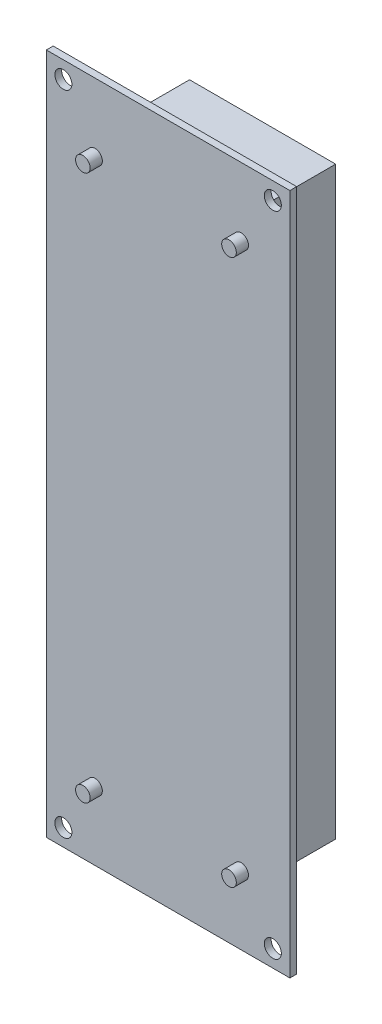
ISO-10303-21;
HEADER;
FILE_DESCRIPTION(('STEP AP214'),'2;1');
FILE_NAME('part.step','',(''),(''),'','','');
FILE_SCHEMA(('AUTOMOTIVE_DESIGN { 1 0 10303 214 1 1 1 1 }'));
ENDSEC;
DATA;
#1=APPLICATION_CONTEXT('core data for automotive mechanical design processes');
#2=APPLICATION_PROTOCOL_DEFINITION('international standard','automotive_design',2000,#1);
#3=PRODUCT_CONTEXT('',#1,'mechanical');
#4=PRODUCT('Part','Part','',(#3));
#5=PRODUCT_RELATED_PRODUCT_CATEGORY('part','',(#4));
#6=PRODUCT_DEFINITION_FORMATION('','',#4);
#7=PRODUCT_DEFINITION_CONTEXT('part definition',#1,'design');
#8=PRODUCT_DEFINITION('design','',#6,#7);
#9=PRODUCT_DEFINITION_SHAPE('','',#8);
#10=(LENGTH_UNIT() NAMED_UNIT(*) SI_UNIT(.MILLI.,.METRE.));
#11=(NAMED_UNIT(*) PLANE_ANGLE_UNIT() SI_UNIT($,.RADIAN.));
#12=(NAMED_UNIT(*) SI_UNIT($,.STERADIAN.) SOLID_ANGLE_UNIT());
#13=UNCERTAINTY_MEASURE_WITH_UNIT(LENGTH_MEASURE(1.E-05),#10,'distance_accuracy_value','');
#14=(GEOMETRIC_REPRESENTATION_CONTEXT(3) GLOBAL_UNCERTAINTY_ASSIGNED_CONTEXT((#13)) GLOBAL_UNIT_ASSIGNED_CONTEXT((#10,
#11,#12)) REPRESENTATION_CONTEXT('',''));
#15=CARTESIAN_POINT('',(0.,0.,0.));
#16=DIRECTION('',(0.,0.,1.));
#17=DIRECTION('',(1.,0.,0.));
#18=AXIS2_PLACEMENT_3D('',#15,#16,#17);
#19=CARTESIAN_POINT('',(25.,-70.,0.7));
#20=DIRECTION('',(-1.,0.,0.));
#21=DIRECTION('',(0.,0.,1.));
#22=AXIS2_PLACEMENT_3D('',#19,#20,#21);
#23=PLANE('',#22);
#24=DIRECTION('',(0.,1.,0.));
#25=VECTOR('',#24,1.);
#26=CARTESIAN_POINT('',(25.,-70.,-0.7));
#27=LINE('',#26,#25);
#28=CARTESIAN_POINT('',(25.,-70.,-0.7));
#29=VERTEX_POINT('',#28);
#30=CARTESIAN_POINT('',(25.,70.,-0.7));
#31=VERTEX_POINT('',#30);
#32=EDGE_CURVE('E116',#29,#31,#27,.T.);
#33=ORIENTED_EDGE('',*,*,#32,.T.);
#34=DIRECTION('',(0.,0.,-1.));
#35=VECTOR('',#34,1.);
#36=CARTESIAN_POINT('',(25.,70.,0.7));
#37=LINE('',#36,#35);
#38=CARTESIAN_POINT('',(25.,70.,0.7));
#39=VERTEX_POINT('',#38);
#40=EDGE_CURVE('E148',#39,#31,#37,.T.);
#41=ORIENTED_EDGE('',*,*,#40,.F.);
#42=DIRECTION('',(0.,1.,0.));
#43=VECTOR('',#42,1.);
#44=CARTESIAN_POINT('',(25.,-70.,0.7));
#45=LINE('',#44,#43);
#46=CARTESIAN_POINT('',(25.,-70.,0.7));
#47=VERTEX_POINT('',#46);
#48=EDGE_CURVE('E125',#47,#39,#45,.T.);
#49=ORIENTED_EDGE('',*,*,#48,.F.);
#50=DIRECTION('',(0.,0.,-1.));
#51=VECTOR('',#50,1.);
#52=CARTESIAN_POINT('',(25.,-70.,0.7));
#53=LINE('',#52,#51);
#54=EDGE_CURVE('E134',#47,#29,#53,.T.);
#55=ORIENTED_EDGE('',*,*,#54,.T.);
#56=EDGE_LOOP('',(#33,#41,#49,#55));
#57=FACE_BOUND('',#56,.T.);
#58=ADVANCED_FACE('F32',(#57),#23,.F.);
#59=CARTESIAN_POINT('',(-25.,70.,0.7));
#60=DIRECTION('',(0.,-1.,0.));
#61=DIRECTION('',(0.,0.,-1.));
#62=AXIS2_PLACEMENT_3D('',#59,#60,#61);
#63=PLANE('',#62);
#64=DIRECTION('',(-1.,0.,0.));
#65=VECTOR('',#64,1.);
#66=CARTESIAN_POINT('',(-25.,70.,-0.7));
#67=LINE('',#66,#65);
#68=CARTESIAN_POINT('',(-25.,70.,-0.7));
#69=VERTEX_POINT('',#68);
#70=EDGE_CURVE('E119',#31,#69,#67,.T.);
#71=ORIENTED_EDGE('',*,*,#70,.T.);
#72=DIRECTION('',(0.,0.,-1.));
#73=VECTOR('',#72,1.);
#74=CARTESIAN_POINT('',(-25.,70.,0.7));
#75=LINE('',#74,#73);
#76=CARTESIAN_POINT('',(-25.,70.,0.7));
#77=VERTEX_POINT('',#76);
#78=EDGE_CURVE('E145',#77,#69,#75,.T.);
#79=ORIENTED_EDGE('',*,*,#78,.F.);
#80=DIRECTION('',(-1.,0.,0.));
#81=VECTOR('',#80,1.);
#82=CARTESIAN_POINT('',(-25.,70.,0.7));
#83=LINE('',#82,#81);
#84=EDGE_CURVE('E128',#39,#77,#83,.T.);
#85=ORIENTED_EDGE('',*,*,#84,.F.);
#86=ORIENTED_EDGE('',*,*,#40,.T.);
#87=EDGE_LOOP('',(#71,#79,#85,#86));
#88=FACE_BOUND('',#87,.T.);
#89=ADVANCED_FACE('F196',(#88),#63,.F.);
#90=CARTESIAN_POINT('',(-25.,-70.,0.7));
#91=DIRECTION('',(1.,0.,0.));
#92=DIRECTION('',(0.,0.,-1.));
#93=AXIS2_PLACEMENT_3D('',#90,#91,#92);
#94=PLANE('',#93);
#95=DIRECTION('',(0.,-1.,0.));
#96=VECTOR('',#95,1.);
#97=CARTESIAN_POINT('',(-25.,-70.,-0.7));
#98=LINE('',#97,#96);
#99=CARTESIAN_POINT('',(-25.,-70.,-0.7));
#100=VERTEX_POINT('',#99);
#101=EDGE_CURVE('E137',#69,#100,#98,.T.);
#102=ORIENTED_EDGE('',*,*,#101,.T.);
#103=DIRECTION('',(0.,0.,-1.));
#104=VECTOR('',#103,1.);
#105=CARTESIAN_POINT('',(-25.,-70.,0.7));
#106=LINE('',#105,#104);
#107=CARTESIAN_POINT('',(-25.,-70.,0.7));
#108=VERTEX_POINT('',#107);
#109=EDGE_CURVE('E142',#108,#100,#106,.T.);
#110=ORIENTED_EDGE('',*,*,#109,.F.);
#111=DIRECTION('',(0.,-1.,0.));
#112=VECTOR('',#111,1.);
#113=CARTESIAN_POINT('',(-25.,-70.,0.7));
#114=LINE('',#113,#112);
#115=EDGE_CURVE('E131',#77,#108,#114,.T.);
#116=ORIENTED_EDGE('',*,*,#115,.F.);
#117=ORIENTED_EDGE('',*,*,#78,.T.);
#118=EDGE_LOOP('',(#102,#110,#116,#117));
#119=FACE_BOUND('',#118,.T.);
#120=ADVANCED_FACE('F201',(#119),#94,.F.);
#121=CARTESIAN_POINT('',(-25.,-70.,0.7));
#122=DIRECTION('',(0.,1.,0.));
#123=DIRECTION('',(0.,0.,1.));
#124=AXIS2_PLACEMENT_3D('',#121,#122,#123);
#125=PLANE('',#124);
#126=DIRECTION('',(1.,0.,0.));
#127=VECTOR('',#126,1.);
#128=CARTESIAN_POINT('',(-25.,-70.,-0.7));
#129=LINE('',#128,#127);
#130=EDGE_CURVE('E129',#100,#29,#129,.T.);
#131=ORIENTED_EDGE('',*,*,#130,.T.);
#132=ORIENTED_EDGE('',*,*,#54,.F.);
#133=DIRECTION('',(1.,0.,0.));
#134=VECTOR('',#133,1.);
#135=CARTESIAN_POINT('',(-25.,-70.,0.7));
#136=LINE('',#135,#134);
#137=EDGE_CURVE('E133',#108,#47,#136,.T.);
#138=ORIENTED_EDGE('',*,*,#137,.F.);
#139=ORIENTED_EDGE('',*,*,#109,.T.);
#140=EDGE_LOOP('',(#131,#132,#138,#139));
#141=FACE_BOUND('',#140,.T.);
#142=ADVANCED_FACE('F165',(#141),#125,.F.);
#143=CARTESIAN_POINT('',(0.,0.,0.7));
#144=DIRECTION('',(0.,0.,-1.));
#145=DIRECTION('',(-1.,0.,0.));
#146=AXIS2_PLACEMENT_3D('',#143,#144,#145);
#147=PLANE('',#146);
#148=CARTESIAN_POINT('',(15.,-56.,0.7));
#149=DIRECTION('',(0.,0.,-1.));
#150=DIRECTION('',(-1.,0.,0.));
#151=AXIS2_PLACEMENT_3D('',#148,#149,#150);
#152=CIRCLE('',#151,1.5);
#153=CARTESIAN_POINT('',(13.5,-56.,0.7));
#154=VERTEX_POINT('',#153);
#155=EDGE_CURVE('E11',#154,#154,#152,.F.);
#156=ORIENTED_EDGE('',*,*,#155,.F.);
#157=EDGE_LOOP('',(#156));
#158=FACE_BOUND('',#157,.T.);
#159=CARTESIAN_POINT('',(-15.,-56.,0.7));
#160=DIRECTION('',(0.,0.,-1.));
#161=DIRECTION('',(-1.,0.,0.));
#162=AXIS2_PLACEMENT_3D('',#159,#160,#161);
#163=CIRCLE('',#162,1.5);
#164=CARTESIAN_POINT('',(-16.5,-56.,0.7));
#165=VERTEX_POINT('',#164);
#166=EDGE_CURVE('E39',#165,#165,#163,.F.);
#167=ORIENTED_EDGE('',*,*,#166,.F.);
#168=EDGE_LOOP('',(#167));
#169=FACE_BOUND('',#168,.T.);
#170=CARTESIAN_POINT('',(-15.,56.,0.7));
#171=DIRECTION('',(0.,0.,-1.));
#172=DIRECTION('',(-1.,0.,0.));
#173=AXIS2_PLACEMENT_3D('',#170,#171,#172);
#174=CIRCLE('',#173,1.5);
#175=CARTESIAN_POINT('',(-16.5,56.,0.7));
#176=VERTEX_POINT('',#175);
#177=EDGE_CURVE('E154',#176,#176,#174,.F.);
#178=ORIENTED_EDGE('',*,*,#177,.F.);
#179=EDGE_LOOP('',(#178));
#180=FACE_BOUND('',#179,.T.);
#181=CARTESIAN_POINT('',(15.,56.,0.7));
#182=DIRECTION('',(0.,0.,-1.));
#183=DIRECTION('',(-1.,0.,0.));
#184=AXIS2_PLACEMENT_3D('',#181,#182,#183);
#185=CIRCLE('',#184,1.5);
#186=CARTESIAN_POINT('',(13.5,56.,0.7));
#187=VERTEX_POINT('',#186);
#188=EDGE_CURVE('E151',#187,#187,#185,.F.);
#189=ORIENTED_EDGE('',*,*,#188,.F.);
#190=EDGE_LOOP('',(#189));
#191=FACE_BOUND('',#190,.T.);
#192=CARTESIAN_POINT('',(-21.5,66.5,0.7));
#193=DIRECTION('',(0.,0.,-1.));
#194=DIRECTION('',(-1.,0.,0.));
#195=AXIS2_PLACEMENT_3D('',#192,#193,#194);
#196=CIRCLE('',#195,1.75);
#197=CARTESIAN_POINT('',(-23.25,66.5,0.7));
#198=VERTEX_POINT('',#197);
#199=EDGE_CURVE('E175',#198,#198,#196,.F.);
#200=ORIENTED_EDGE('',*,*,#199,.F.);
#201=EDGE_LOOP('',(#200));
#202=FACE_BOUND('',#201,.T.);
#203=CARTESIAN_POINT('',(21.5,-66.5,0.7));
#204=DIRECTION('',(0.,0.,-1.));
#205=DIRECTION('',(-1.,0.,0.));
#206=AXIS2_PLACEMENT_3D('',#203,#204,#205);
#207=CIRCLE('',#206,1.75);
#208=CARTESIAN_POINT('',(19.75,-66.5,0.7));
#209=VERTEX_POINT('',#208);
#210=EDGE_CURVE('E179',#209,#209,#207,.F.);
#211=ORIENTED_EDGE('',*,*,#210,.F.);
#212=EDGE_LOOP('',(#211));
#213=FACE_BOUND('',#212,.T.);
#214=CARTESIAN_POINT('',(-21.5,-66.5,0.7));
#215=DIRECTION('',(0.,0.,-1.));
#216=DIRECTION('',(-1.,0.,0.));
#217=AXIS2_PLACEMENT_3D('',#214,#215,#216);
#218=CIRCLE('',#217,1.75);
#219=CARTESIAN_POINT('',(-23.25,-66.5,0.7));
#220=VERTEX_POINT('',#219);
#221=EDGE_CURVE('E183',#220,#220,#218,.F.);
#222=ORIENTED_EDGE('',*,*,#221,.F.);
#223=EDGE_LOOP('',(#222));
#224=FACE_BOUND('',#223,.T.);
#225=CARTESIAN_POINT('',(21.5,66.5,0.7));
#226=DIRECTION('',(0.,0.,-1.));
#227=DIRECTION('',(-1.,0.,0.));
#228=AXIS2_PLACEMENT_3D('',#225,#226,#227);
#229=CIRCLE('',#228,1.75);
#230=CARTESIAN_POINT('',(19.75,66.5,0.7));
#231=VERTEX_POINT('',#230);
#232=EDGE_CURVE('E187',#231,#231,#229,.F.);
#233=ORIENTED_EDGE('',*,*,#232,.F.);
#234=EDGE_LOOP('',(#233));
#235=FACE_BOUND('',#234,.T.);
#236=ORIENTED_EDGE('',*,*,#48,.T.);
#237=ORIENTED_EDGE('',*,*,#84,.T.);
#238=ORIENTED_EDGE('',*,*,#115,.T.);
#239=ORIENTED_EDGE('',*,*,#137,.T.);
#240=EDGE_LOOP('',(#236,#237,#238,#239));
#241=FACE_BOUND('',#240,.T.);
#242=ADVANCED_FACE('F161',(#158,#169,#180,#191,#202,#213,#224,#235,#241),#147,.F.);
#243=CARTESIAN_POINT('',(0.,0.,-0.7));
#244=DIRECTION('',(0.,0.,-1.));
#245=DIRECTION('',(-1.,0.,0.));
#246=AXIS2_PLACEMENT_3D('',#243,#244,#245);
#247=PLANE('',#246);
#248=CARTESIAN_POINT('',(-21.5,66.5,-0.7));
#249=DIRECTION('',(0.,0.,-1.));
#250=DIRECTION('',(-1.,0.,0.));
#251=AXIS2_PLACEMENT_3D('',#248,#249,#250);
#252=CIRCLE('',#251,1.75);
#253=CARTESIAN_POINT('',(-23.25,66.5,-0.7));
#254=VERTEX_POINT('',#253);
#255=EDGE_CURVE('E420',#254,#254,#252,.T.);
#256=ORIENTED_EDGE('',*,*,#255,.F.);
#257=EDGE_LOOP('',(#256));
#258=FACE_BOUND('',#257,.T.);
#259=CARTESIAN_POINT('',(21.5,-66.5,-0.7));
#260=DIRECTION('',(0.,0.,-1.));
#261=DIRECTION('',(-1.,0.,0.));
#262=AXIS2_PLACEMENT_3D('',#259,#260,#261);
#263=CIRCLE('',#262,1.75);
#264=CARTESIAN_POINT('',(19.75,-66.5,-0.7));
#265=VERTEX_POINT('',#264);
#266=EDGE_CURVE('E421',#265,#265,#263,.T.);
#267=ORIENTED_EDGE('',*,*,#266,.F.);
#268=EDGE_LOOP('',(#267));
#269=FACE_BOUND('',#268,.T.);
#270=CARTESIAN_POINT('',(-21.5,-66.5,-0.7));
#271=DIRECTION('',(0.,0.,-1.));
#272=DIRECTION('',(-1.,0.,0.));
#273=AXIS2_PLACEMENT_3D('',#270,#271,#272);
#274=CIRCLE('',#273,1.75);
#275=CARTESIAN_POINT('',(-23.25,-66.5,-0.7));
#276=VERTEX_POINT('',#275);
#277=EDGE_CURVE('E428',#276,#276,#274,.T.);
#278=ORIENTED_EDGE('',*,*,#277,.F.);
#279=EDGE_LOOP('',(#278));
#280=FACE_BOUND('',#279,.T.);
#281=CARTESIAN_POINT('',(21.5,66.5,-0.7));
#282=DIRECTION('',(0.,0.,-1.));
#283=DIRECTION('',(-1.,0.,0.));
#284=AXIS2_PLACEMENT_3D('',#281,#282,#283);
#285=CIRCLE('',#284,1.75);
#286=CARTESIAN_POINT('',(19.75,66.5,-0.7));
#287=VERTEX_POINT('',#286);
#288=EDGE_CURVE('E416',#287,#287,#285,.T.);
#289=ORIENTED_EDGE('',*,*,#288,.F.);
#290=EDGE_LOOP('',(#289));
#291=FACE_BOUND('',#290,.T.);
#292=DIRECTION('',(1.,0.,0.));
#293=VECTOR('',#292,1.);
#294=CARTESIAN_POINT('',(-15.,60.,-0.7));
#295=LINE('',#294,#293);
#296=CARTESIAN_POINT('',(-15.,60.,-0.7));
#297=VERTEX_POINT('',#296);
#298=CARTESIAN_POINT('',(15.,60.,-0.7));
#299=VERTEX_POINT('',#298);
#300=EDGE_CURVE('E46',#297,#299,#295,.T.);
#301=ORIENTED_EDGE('',*,*,#300,.F.);
#302=DIRECTION('',(0.,1.,0.));
#303=VECTOR('',#302,1.);
#304=CARTESIAN_POINT('',(-15.,-60.,-0.7));
#305=LINE('',#304,#303);
#306=CARTESIAN_POINT('',(-15.,-60.,-0.7));
#307=VERTEX_POINT('',#306);
#308=EDGE_CURVE('E50',#307,#297,#305,.T.);
#309=ORIENTED_EDGE('',*,*,#308,.F.);
#310=DIRECTION('',(-1.,0.,0.));
#311=VECTOR('',#310,1.);
#312=CARTESIAN_POINT('',(15.,-60.,-0.7));
#313=LINE('',#312,#311);
#314=CARTESIAN_POINT('',(15.,-60.,-0.7));
#315=VERTEX_POINT('',#314);
#316=EDGE_CURVE('E403',#315,#307,#313,.T.);
#317=ORIENTED_EDGE('',*,*,#316,.F.);
#318=DIRECTION('',(0.,-1.,0.));
#319=VECTOR('',#318,1.);
#320=CARTESIAN_POINT('',(15.,60.,-0.7));
#321=LINE('',#320,#319);
#322=EDGE_CURVE('E405',#299,#315,#321,.T.);
#323=ORIENTED_EDGE('',*,*,#322,.F.);
#324=EDGE_LOOP('',(#301,#309,#317,#323));
#325=FACE_BOUND('',#324,.T.);
#326=ORIENTED_EDGE('',*,*,#32,.F.);
#327=ORIENTED_EDGE('',*,*,#130,.F.);
#328=ORIENTED_EDGE('',*,*,#101,.F.);
#329=ORIENTED_EDGE('',*,*,#70,.F.);
#330=EDGE_LOOP('',(#326,#327,#328,#329));
#331=FACE_BOUND('',#330,.T.);
#332=ADVANCED_FACE('F164',(#258,#269,#280,#291,#325,#331),#247,.T.);
#333=CARTESIAN_POINT('',(-15.,60.,-18.7));
#334=DIRECTION('',(0.,-1.,0.));
#335=DIRECTION('',(0.,0.,-1.));
#336=AXIS2_PLACEMENT_3D('',#333,#334,#335);
#337=PLANE('',#336);
#338=ORIENTED_EDGE('',*,*,#300,.T.);
#339=DIRECTION('',(0.,0.,1.));
#340=VECTOR('',#339,1.);
#341=CARTESIAN_POINT('',(15.,60.,-18.7));
#342=LINE('',#341,#340);
#343=CARTESIAN_POINT('',(15.,60.,-18.7));
#344=VERTEX_POINT('',#343);
#345=EDGE_CURVE('E99',#344,#299,#342,.T.);
#346=ORIENTED_EDGE('',*,*,#345,.F.);
#347=DIRECTION('',(1.,0.,0.));
#348=VECTOR('',#347,1.);
#349=CARTESIAN_POINT('',(-15.,60.,-18.7));
#350=LINE('',#349,#348);
#351=CARTESIAN_POINT('',(-15.,60.,-18.7));
#352=VERTEX_POINT('',#351);
#353=EDGE_CURVE('E105',#352,#344,#350,.T.);
#354=ORIENTED_EDGE('',*,*,#353,.F.);
#355=DIRECTION('',(0.,0.,1.));
#356=VECTOR('',#355,1.);
#357=CARTESIAN_POINT('',(-15.,60.,-18.7));
#358=LINE('',#357,#356);
#359=EDGE_CURVE('E407',#352,#297,#358,.T.);
#360=ORIENTED_EDGE('',*,*,#359,.T.);
#361=EDGE_LOOP('',(#338,#346,#354,#360));
#362=FACE_BOUND('',#361,.T.);
#363=ADVANCED_FACE('F115',(#362),#337,.F.);
#364=CARTESIAN_POINT('',(15.,60.,-18.7));
#365=DIRECTION('',(-1.,0.,0.));
#366=DIRECTION('',(0.,0.,1.));
#367=AXIS2_PLACEMENT_3D('',#364,#365,#366);
#368=PLANE('',#367);
#369=ORIENTED_EDGE('',*,*,#322,.T.);
#370=DIRECTION('',(0.,0.,1.));
#371=VECTOR('',#370,1.);
#372=CARTESIAN_POINT('',(15.,-60.,-18.7));
#373=LINE('',#372,#371);
#374=CARTESIAN_POINT('',(15.,-60.,-18.7));
#375=VERTEX_POINT('',#374);
#376=EDGE_CURVE('E101',#375,#315,#373,.T.);
#377=ORIENTED_EDGE('',*,*,#376,.F.);
#378=DIRECTION('',(0.,-1.,0.));
#379=VECTOR('',#378,1.);
#380=CARTESIAN_POINT('',(15.,60.,-18.7));
#381=LINE('',#380,#379);
#382=EDGE_CURVE('E94',#344,#375,#381,.T.);
#383=ORIENTED_EDGE('',*,*,#382,.F.);
#384=ORIENTED_EDGE('',*,*,#345,.T.);
#385=EDGE_LOOP('',(#369,#377,#383,#384));
#386=FACE_BOUND('',#385,.T.);
#387=ADVANCED_FACE('F97',(#386),#368,.F.);
#388=CARTESIAN_POINT('',(15.,-60.,-18.7));
#389=DIRECTION('',(0.,1.,0.));
#390=DIRECTION('',(0.,0.,1.));
#391=AXIS2_PLACEMENT_3D('',#388,#389,#390);
#392=PLANE('',#391);
#393=ORIENTED_EDGE('',*,*,#316,.T.);
#394=DIRECTION('',(0.,0.,1.));
#395=VECTOR('',#394,1.);
#396=CARTESIAN_POINT('',(-15.,-60.,-18.7));
#397=LINE('',#396,#395);
#398=CARTESIAN_POINT('',(-15.,-60.,-18.7));
#399=VERTEX_POINT('',#398);
#400=EDGE_CURVE('E121',#399,#307,#397,.T.);
#401=ORIENTED_EDGE('',*,*,#400,.F.);
#402=DIRECTION('',(-1.,0.,0.));
#403=VECTOR('',#402,1.);
#404=CARTESIAN_POINT('',(15.,-60.,-18.7));
#405=LINE('',#404,#403);
#406=EDGE_CURVE('E104',#375,#399,#405,.T.);
#407=ORIENTED_EDGE('',*,*,#406,.F.);
#408=ORIENTED_EDGE('',*,*,#376,.T.);
#409=EDGE_LOOP('',(#393,#401,#407,#408));
#410=FACE_BOUND('',#409,.T.);
#411=ADVANCED_FACE('F344',(#410),#392,.F.);
#412=CARTESIAN_POINT('',(-15.,-60.,-18.7));
#413=DIRECTION('',(1.,0.,0.));
#414=DIRECTION('',(0.,0.,-1.));
#415=AXIS2_PLACEMENT_3D('',#412,#413,#414);
#416=PLANE('',#415);
#417=ORIENTED_EDGE('',*,*,#308,.T.);
#418=ORIENTED_EDGE('',*,*,#359,.F.);
#419=DIRECTION('',(0.,1.,0.));
#420=VECTOR('',#419,1.);
#421=CARTESIAN_POINT('',(-15.,-60.,-18.7));
#422=LINE('',#421,#420);
#423=EDGE_CURVE('E110',#399,#352,#422,.T.);
#424=ORIENTED_EDGE('',*,*,#423,.F.);
#425=ORIENTED_EDGE('',*,*,#400,.T.);
#426=EDGE_LOOP('',(#417,#418,#424,#425));
#427=FACE_BOUND('',#426,.T.);
#428=ADVANCED_FACE('F341',(#427),#416,.F.);
#429=CARTESIAN_POINT('',(0.,0.,-18.7));
#430=DIRECTION('',(0.,0.,-1.));
#431=DIRECTION('',(-1.,0.,0.));
#432=AXIS2_PLACEMENT_3D('',#429,#430,#431);
#433=PLANE('',#432);
#434=ORIENTED_EDGE('',*,*,#353,.T.);
#435=ORIENTED_EDGE('',*,*,#382,.T.);
#436=ORIENTED_EDGE('',*,*,#406,.T.);
#437=ORIENTED_EDGE('',*,*,#423,.T.);
#438=EDGE_LOOP('',(#434,#435,#436,#437));
#439=FACE_BOUND('',#438,.T.);
#440=ADVANCED_FACE('F108',(#439),#433,.T.);
#441=CARTESIAN_POINT('',(21.5,66.5,5.64974746830584));
#442=DIRECTION('',(0.,0.,-1.));
#443=DIRECTION('',(-1.,0.,0.));
#444=AXIS2_PLACEMENT_3D('',#441,#442,#443);
#445=CYLINDRICAL_SURFACE('',#444,1.75);
#446=ORIENTED_EDGE('',*,*,#232,.T.);
#447=EDGE_LOOP('',(#446));
#448=FACE_BOUND('',#447,.T.);
#449=ORIENTED_EDGE('',*,*,#288,.T.);
#450=EDGE_LOOP('',(#449));
#451=FACE_BOUND('',#450,.T.);
#452=ADVANCED_FACE('F329',(#448,#451),#445,.F.);
#453=CARTESIAN_POINT('',(-21.5,-66.5,5.64974746830584));
#454=DIRECTION('',(0.,0.,-1.));
#455=DIRECTION('',(-1.,0.,0.));
#456=AXIS2_PLACEMENT_3D('',#453,#454,#455);
#457=CYLINDRICAL_SURFACE('',#456,1.75);
#458=ORIENTED_EDGE('',*,*,#221,.T.);
#459=EDGE_LOOP('',(#458));
#460=FACE_BOUND('',#459,.T.);
#461=ORIENTED_EDGE('',*,*,#277,.T.);
#462=EDGE_LOOP('',(#461));
#463=FACE_BOUND('',#462,.T.);
#464=ADVANCED_FACE('F325',(#460,#463),#457,.F.);
#465=CARTESIAN_POINT('',(21.5,-66.5,5.64974746830584));
#466=DIRECTION('',(0.,0.,-1.));
#467=DIRECTION('',(-1.,0.,0.));
#468=AXIS2_PLACEMENT_3D('',#465,#466,#467);
#469=CYLINDRICAL_SURFACE('',#468,1.75);
#470=ORIENTED_EDGE('',*,*,#210,.T.);
#471=EDGE_LOOP('',(#470));
#472=FACE_BOUND('',#471,.T.);
#473=ORIENTED_EDGE('',*,*,#266,.T.);
#474=EDGE_LOOP('',(#473));
#475=FACE_BOUND('',#474,.T.);
#476=ADVANCED_FACE('F328',(#472,#475),#469,.F.);
#477=CARTESIAN_POINT('',(-21.5,66.5,5.64974746830584));
#478=DIRECTION('',(0.,0.,-1.));
#479=DIRECTION('',(-1.,0.,0.));
#480=AXIS2_PLACEMENT_3D('',#477,#478,#479);
#481=CYLINDRICAL_SURFACE('',#480,1.75);
#482=ORIENTED_EDGE('',*,*,#199,.T.);
#483=EDGE_LOOP('',(#482));
#484=FACE_BOUND('',#483,.T.);
#485=ORIENTED_EDGE('',*,*,#255,.T.);
#486=EDGE_LOOP('',(#485));
#487=FACE_BOUND('',#486,.T.);
#488=ADVANCED_FACE('F240',(#484,#487),#481,.F.);
#489=CARTESIAN_POINT('',(15.,56.,3.2));
#490=DIRECTION('',(0.,0.,-1.));
#491=DIRECTION('',(-1.,0.,0.));
#492=AXIS2_PLACEMENT_3D('',#489,#490,#491);
#493=CYLINDRICAL_SURFACE('',#492,1.5);
#494=CARTESIAN_POINT('',(15.,56.,3.2));
#495=DIRECTION('',(0.,0.,1.));
#496=DIRECTION('',(1.,0.,0.));
#497=AXIS2_PLACEMENT_3D('',#494,#495,#496);
#498=CIRCLE('',#497,1.5);
#499=CARTESIAN_POINT('',(16.5,56.,3.2));
#500=VERTEX_POINT('',#499);
#501=EDGE_CURVE('E431',#500,#500,#498,.T.);
#502=ORIENTED_EDGE('',*,*,#501,.F.);
#503=EDGE_LOOP('',(#502));
#504=FACE_BOUND('',#503,.T.);
#505=ORIENTED_EDGE('',*,*,#188,.T.);
#506=EDGE_LOOP('',(#505));
#507=FACE_BOUND('',#506,.T.);
#508=ADVANCED_FACE('F245',(#504,#507),#493,.T.);
#509=CARTESIAN_POINT('',(15.,56.,3.2));
#510=DIRECTION('',(0.,0.,1.));
#511=DIRECTION('',(1.,0.,0.));
#512=AXIS2_PLACEMENT_3D('',#509,#510,#511);
#513=PLANE('',#512);
#514=ORIENTED_EDGE('',*,*,#501,.T.);
#515=EDGE_LOOP('',(#514));
#516=FACE_BOUND('',#515,.T.);
#517=ADVANCED_FACE('F250',(#516),#513,.T.);
#518=CARTESIAN_POINT('',(-15.,56.,3.2));
#519=DIRECTION('',(0.,0.,-1.));
#520=DIRECTION('',(-1.,0.,0.));
#521=AXIS2_PLACEMENT_3D('',#518,#519,#520);
#522=CYLINDRICAL_SURFACE('',#521,1.5);
#523=CARTESIAN_POINT('',(-15.,56.,3.2));
#524=DIRECTION('',(0.,0.,1.));
#525=DIRECTION('',(1.,0.,0.));
#526=AXIS2_PLACEMENT_3D('',#523,#524,#525);
#527=CIRCLE('',#526,1.5);
#528=CARTESIAN_POINT('',(-13.5,56.,3.2));
#529=VERTEX_POINT('',#528);
#530=EDGE_CURVE('E434',#529,#529,#527,.T.);
#531=ORIENTED_EDGE('',*,*,#530,.F.);
#532=EDGE_LOOP('',(#531));
#533=FACE_BOUND('',#532,.T.);
#534=ORIENTED_EDGE('',*,*,#177,.T.);
#535=EDGE_LOOP('',(#534));
#536=FACE_BOUND('',#535,.T.);
#537=ADVANCED_FACE('F260',(#533,#536),#522,.T.);
#538=CARTESIAN_POINT('',(-15.,56.,3.2));
#539=DIRECTION('',(0.,0.,1.));
#540=DIRECTION('',(1.,0.,0.));
#541=AXIS2_PLACEMENT_3D('',#538,#539,#540);
#542=PLANE('',#541);
#543=ORIENTED_EDGE('',*,*,#530,.T.);
#544=EDGE_LOOP('',(#543));
#545=FACE_BOUND('',#544,.T.);
#546=ADVANCED_FACE('F270',(#545),#542,.T.);
#547=CARTESIAN_POINT('',(-15.,-56.,3.2));
#548=DIRECTION('',(0.,0.,-1.));
#549=DIRECTION('',(-1.,0.,0.));
#550=AXIS2_PLACEMENT_3D('',#547,#548,#549);
#551=CYLINDRICAL_SURFACE('',#550,1.5);
#552=CARTESIAN_POINT('',(-15.,-56.,3.2));
#553=DIRECTION('',(0.,0.,1.));
#554=DIRECTION('',(1.,0.,0.));
#555=AXIS2_PLACEMENT_3D('',#552,#553,#554);
#556=CIRCLE('',#555,1.5);
#557=CARTESIAN_POINT('',(-13.5,-56.,3.2));
#558=VERTEX_POINT('',#557);
#559=EDGE_CURVE('E437',#558,#558,#556,.T.);
#560=ORIENTED_EDGE('',*,*,#559,.F.);
#561=EDGE_LOOP('',(#560));
#562=FACE_BOUND('',#561,.T.);
#563=ORIENTED_EDGE('',*,*,#166,.T.);
#564=EDGE_LOOP('',(#563));
#565=FACE_BOUND('',#564,.T.);
#566=ADVANCED_FACE('F159',(#562,#565),#551,.T.);
#567=CARTESIAN_POINT('',(-15.,-56.,3.2));
#568=DIRECTION('',(0.,0.,1.));
#569=DIRECTION('',(1.,0.,0.));
#570=AXIS2_PLACEMENT_3D('',#567,#568,#569);
#571=PLANE('',#570);
#572=ORIENTED_EDGE('',*,*,#559,.T.);
#573=EDGE_LOOP('',(#572));
#574=FACE_BOUND('',#573,.T.);
#575=ADVANCED_FACE('F289',(#574),#571,.T.);
#576=CARTESIAN_POINT('',(15.,-56.,3.2));
#577=DIRECTION('',(0.,0.,-1.));
#578=DIRECTION('',(-1.,0.,0.));
#579=AXIS2_PLACEMENT_3D('',#576,#577,#578);
#580=CYLINDRICAL_SURFACE('',#579,1.5);
#581=CARTESIAN_POINT('',(15.,-56.,3.2));
#582=DIRECTION('',(0.,0.,1.));
#583=DIRECTION('',(1.,0.,0.));
#584=AXIS2_PLACEMENT_3D('',#581,#582,#583);
#585=CIRCLE('',#584,1.5);
#586=CARTESIAN_POINT('',(16.5,-56.,3.2));
#587=VERTEX_POINT('',#586);
#588=EDGE_CURVE('E440',#587,#587,#585,.T.);
#589=ORIENTED_EDGE('',*,*,#588,.F.);
#590=EDGE_LOOP('',(#589));
#591=FACE_BOUND('',#590,.T.);
#592=ORIENTED_EDGE('',*,*,#155,.T.);
#593=EDGE_LOOP('',(#592));
#594=FACE_BOUND('',#593,.T.);
#595=ADVANCED_FACE('F299',(#591,#594),#580,.T.);
#596=CARTESIAN_POINT('',(15.,-56.,3.2));
#597=DIRECTION('',(0.,0.,1.));
#598=DIRECTION('',(1.,0.,0.));
#599=AXIS2_PLACEMENT_3D('',#596,#597,#598);
#600=PLANE('',#599);
#601=ORIENTED_EDGE('',*,*,#588,.T.);
#602=EDGE_LOOP('',(#601));
#603=FACE_BOUND('',#602,.T.);
#604=ADVANCED_FACE('F309',(#603),#600,.T.);
#605=CLOSED_SHELL('',(#58,#89,#120,#142,#242,#332,#363,#387,#411,#428,#440,#452,#464,#476,#488,
#508,#517,#537,#546,#566,#575,#595,#604));
#606=MANIFOLD_SOLID_BREP('B2',#605);
#607=ADVANCED_BREP_SHAPE_REPRESENTATION('',(#18,#606),#14);
#608=SHAPE_DEFINITION_REPRESENTATION(#9,#607);
ENDSEC;
END-ISO-10303-21;
